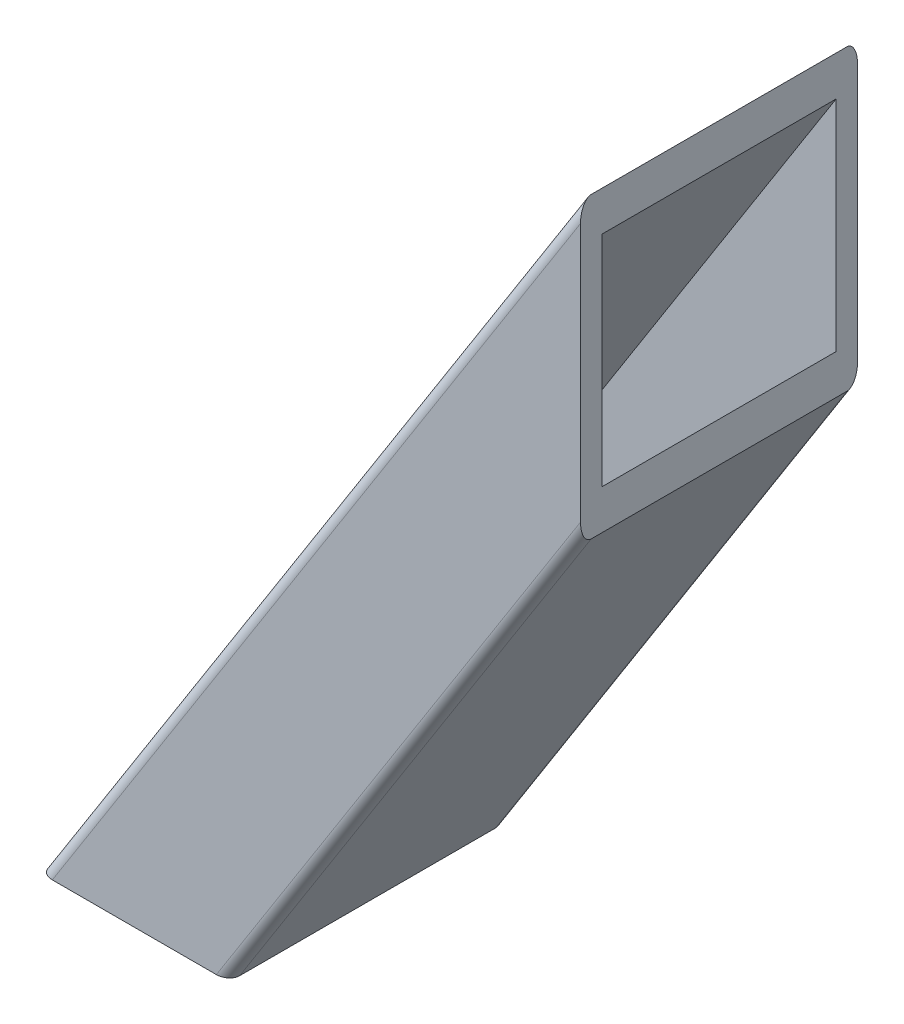
ISO-10303-21;
HEADER;
FILE_DESCRIPTION(('STEP AP214'),'2;1');
FILE_NAME('part.step','',(''),(''),'','','');
FILE_SCHEMA(('AUTOMOTIVE_DESIGN { 1 0 10303 214 1 1 1 1 }'));
ENDSEC;
DATA;
#1=APPLICATION_CONTEXT('core data for automotive mechanical design processes');
#2=APPLICATION_PROTOCOL_DEFINITION('international standard','automotive_design',2000,#1);
#3=PRODUCT_CONTEXT('',#1,'mechanical');
#4=PRODUCT('Part','Part','',(#3));
#5=PRODUCT_RELATED_PRODUCT_CATEGORY('part','',(#4));
#6=PRODUCT_DEFINITION_FORMATION('','',#4);
#7=PRODUCT_DEFINITION_CONTEXT('part definition',#1,'design');
#8=PRODUCT_DEFINITION('design','',#6,#7);
#9=PRODUCT_DEFINITION_SHAPE('','',#8);
#10=(LENGTH_UNIT() NAMED_UNIT(*) SI_UNIT(.MILLI.,.METRE.));
#11=(NAMED_UNIT(*) PLANE_ANGLE_UNIT() SI_UNIT($,.RADIAN.));
#12=(NAMED_UNIT(*) SI_UNIT($,.STERADIAN.) SOLID_ANGLE_UNIT());
#13=UNCERTAINTY_MEASURE_WITH_UNIT(LENGTH_MEASURE(1.E-05),#10,'distance_accuracy_value','');
#14=(GEOMETRIC_REPRESENTATION_CONTEXT(3) GLOBAL_UNCERTAINTY_ASSIGNED_CONTEXT((#13)) GLOBAL_UNIT_ASSIGNED_CONTEXT((#10,
#11,#12)) REPRESENTATION_CONTEXT('',''));
#15=CARTESIAN_POINT('',(0.,0.,0.));
#16=DIRECTION('',(0.,0.,1.));
#17=DIRECTION('',(1.,0.,0.));
#18=AXIS2_PLACEMENT_3D('',#15,#16,#17);
#19=CARTESIAN_POINT('',(32.9904848861495,80.,26.));
#20=DIRECTION('',(-1.,0.,0.));
#21=DIRECTION('',(0.,0.,1.));
#22=AXIS2_PLACEMENT_3D('',#19,#20,#21);
#23=PLANE('',#22);
#24=DIRECTION('',(0.,0.,-1.));
#25=VECTOR('',#24,1.);
#26=CARTESIAN_POINT('',(32.9904848861495,52.,26.));
#27=LINE('',#26,#25);
#28=CARTESIAN_POINT('',(32.9904848861495,52.,25.));
#29=VERTEX_POINT('',#28);
#30=CARTESIAN_POINT('',(32.9904848861495,52.,1.00000000000001));
#31=VERTEX_POINT('',#30);
#32=EDGE_CURVE('E217',#29,#31,#27,.T.);
#33=ORIENTED_EDGE('',*,*,#32,.T.);
#34=CARTESIAN_POINT('',(32.9904848861495,53.8666666666667,1.));
#35=DIRECTION('',(-1.,0.,0.));
#36=DIRECTION('',(0.,1.,0.));
#37=AXIS2_PLACEMENT_3D('',#34,#35,#36);
#38=ELLIPSE('',#37,1.86666666666667,1.);
#39=CARTESIAN_POINT('',(32.9904848861495,53.8666666666667,0.));
#40=VERTEX_POINT('',#39);
#41=EDGE_CURVE('E231',#31,#40,#38,.F.);
#42=ORIENTED_EDGE('',*,*,#41,.T.);
#43=DIRECTION('',(0.,1.,0.));
#44=VECTOR('',#43,1.);
#45=CARTESIAN_POINT('',(32.9904848861495,80.,0.));
#46=LINE('',#45,#44);
#47=CARTESIAN_POINT('',(32.9904848861495,78.1333333333333,0.));
#48=VERTEX_POINT('',#47);
#49=EDGE_CURVE('E192',#40,#48,#46,.T.);
#50=ORIENTED_EDGE('',*,*,#49,.T.);
#51=CARTESIAN_POINT('',(32.9904848861495,78.1333333333333,1.));
#52=DIRECTION('',(-1.,0.,0.));
#53=DIRECTION('',(0.,-1.,0.));
#54=AXIS2_PLACEMENT_3D('',#51,#52,#53);
#55=ELLIPSE('',#54,1.86666666666667,1.);
#56=CARTESIAN_POINT('',(32.9904848861495,80.,1.00000000000001));
#57=VERTEX_POINT('',#56);
#58=EDGE_CURVE('E229',#48,#57,#55,.F.);
#59=ORIENTED_EDGE('',*,*,#58,.T.);
#60=DIRECTION('',(0.,0.,-1.));
#61=VECTOR('',#60,1.);
#62=CARTESIAN_POINT('',(32.9904848861495,80.,26.));
#63=LINE('',#62,#61);
#64=CARTESIAN_POINT('',(32.9904848861495,80.,25.));
#65=VERTEX_POINT('',#64);
#66=EDGE_CURVE('E214',#65,#57,#63,.T.);
#67=ORIENTED_EDGE('',*,*,#66,.F.);
#68=CARTESIAN_POINT('',(32.9904848861495,78.1333333333333,25.));
#69=DIRECTION('',(-1.,0.,0.));
#70=DIRECTION('',(0.,1.,0.));
#71=AXIS2_PLACEMENT_3D('',#68,#69,#70);
#72=ELLIPSE('',#71,1.86666666666667,1.);
#73=CARTESIAN_POINT('',(32.9904848861495,78.1333333333333,26.));
#74=VERTEX_POINT('',#73);
#75=EDGE_CURVE('E225',#65,#74,#72,.F.);
#76=ORIENTED_EDGE('',*,*,#75,.T.);
#77=DIRECTION('',(0.,1.,0.));
#78=VECTOR('',#77,1.);
#79=CARTESIAN_POINT('',(32.9904848861495,80.,26.));
#80=LINE('',#79,#78);
#81=CARTESIAN_POINT('',(32.9904848861495,53.8666666666667,26.));
#82=VERTEX_POINT('',#81);
#83=EDGE_CURVE('E198',#82,#74,#80,.T.);
#84=ORIENTED_EDGE('',*,*,#83,.F.);
#85=CARTESIAN_POINT('',(32.9904848861495,53.8666666666667,25.));
#86=DIRECTION('',(-1.,0.,0.));
#87=DIRECTION('',(0.,-1.,0.));
#88=AXIS2_PLACEMENT_3D('',#85,#86,#87);
#89=ELLIPSE('',#88,1.86666666666667,1.);
#90=EDGE_CURVE('E227',#82,#29,#89,.F.);
#91=ORIENTED_EDGE('',*,*,#90,.T.);
#92=EDGE_LOOP('',(#33,#42,#50,#59,#67,#76,#84,#91));
#93=FACE_BOUND('',#92,.T.);
#94=DIRECTION('',(0.,1.,0.));
#95=VECTOR('',#94,1.);
#96=CARTESIAN_POINT('',(32.9904848861495,80.,2.));
#97=LINE('',#96,#95);
#98=CARTESIAN_POINT('',(32.9904848861495,55.7333333333333,2.));
#99=VERTEX_POINT('',#98);
#100=CARTESIAN_POINT('',(32.9904848861495,76.2666666666667,2.));
#101=VERTEX_POINT('',#100);
#102=EDGE_CURVE('E176',#99,#101,#97,.T.);
#103=ORIENTED_EDGE('',*,*,#102,.F.);
#104=DIRECTION('',(0.,0.,-1.));
#105=VECTOR('',#104,1.);
#106=CARTESIAN_POINT('',(32.9904848861495,55.7333333333333,26.));
#107=LINE('',#106,#105);
#108=CARTESIAN_POINT('',(32.9904848861495,55.7333333333333,24.));
#109=VERTEX_POINT('',#108);
#110=EDGE_CURVE('E190',#109,#99,#107,.T.);
#111=ORIENTED_EDGE('',*,*,#110,.F.);
#112=DIRECTION('',(0.,1.,0.));
#113=VECTOR('',#112,1.);
#114=CARTESIAN_POINT('',(32.9904848861495,80.,24.));
#115=LINE('',#114,#113);
#116=CARTESIAN_POINT('',(32.9904848861495,76.2666666666667,24.));
#117=VERTEX_POINT('',#116);
#118=EDGE_CURVE('E179',#109,#117,#115,.T.);
#119=ORIENTED_EDGE('',*,*,#118,.T.);
#120=DIRECTION('',(0.,0.,-1.));
#121=VECTOR('',#120,1.);
#122=CARTESIAN_POINT('',(32.9904848861495,76.2666666666667,26.));
#123=LINE('',#122,#121);
#124=EDGE_CURVE('E186',#117,#101,#123,.T.);
#125=ORIENTED_EDGE('',*,*,#124,.T.);
#126=EDGE_LOOP('',(#103,#111,#119,#125));
#127=FACE_BOUND('',#126,.T.);
#128=ADVANCED_FACE('F37',(#93,#127),#23,.F.);
#129=CARTESIAN_POINT('',(0.,0.,26.));
#130=DIRECTION('',(-0.844399315538349,0.535714285714286,0.));
#131=DIRECTION('',(-0.535714285714286,-0.844399315538349,0.));
#132=AXIS2_PLACEMENT_3D('',#129,#130,#131);
#133=PLANE('',#132);
#134=DIRECTION('',(0.,0.,-1.));
#135=VECTOR('',#134,1.);
#136=CARTESIAN_POINT('',(0.,0.,26.));
#137=LINE('',#136,#135);
#138=CARTESIAN_POINT('',(0.,0.,25.));
#139=VERTEX_POINT('',#138);
#140=CARTESIAN_POINT('',(0.,0.,1.00000000000001));
#141=VERTEX_POINT('',#140);
#142=EDGE_CURVE('E205',#139,#141,#137,.T.);
#143=ORIENTED_EDGE('',*,*,#142,.T.);
#144=DIRECTION('',(0.535714285714286,0.844399315538349,0.));
#145=VECTOR('',#144,1.);
#146=CARTESIAN_POINT('',(0.,0.,1.));
#147=LINE('',#146,#145);
#148=EDGE_CURVE('E222',#141,#31,#147,.T.);
#149=ORIENTED_EDGE('',*,*,#148,.T.);
#150=ORIENTED_EDGE('',*,*,#32,.F.);
#151=DIRECTION('',(0.535714285714286,0.844399315538349,0.));
#152=VECTOR('',#151,1.);
#153=CARTESIAN_POINT('',(0.,0.,25.));
#154=LINE('',#153,#152);
#155=EDGE_CURVE('E220',#29,#139,#154,.F.);
#156=ORIENTED_EDGE('',*,*,#155,.T.);
#157=EDGE_LOOP('',(#143,#149,#150,#156));
#158=FACE_BOUND('',#157,.T.);
#159=ADVANCED_FACE('F278',(#158),#133,.F.);
#160=CARTESIAN_POINT('',(-17.7641072463882,0.,26.));
#161=DIRECTION('',(0.844399315538349,-0.535714285714286,0.));
#162=DIRECTION('',(0.535714285714286,0.844399315538349,0.));
#163=AXIS2_PLACEMENT_3D('',#160,#161,#162);
#164=PLANE('',#163);
#165=ORIENTED_EDGE('',*,*,#66,.T.);
#166=DIRECTION('',(-0.535714285714286,-0.844399315538349,0.));
#167=VECTOR('',#166,1.);
#168=CARTESIAN_POINT('',(-17.7641072463882,0.,1.));
#169=LINE('',#168,#167);
#170=CARTESIAN_POINT('',(-17.7641072463882,0.,1.00000000000001));
#171=VERTEX_POINT('',#170);
#172=EDGE_CURVE('E245',#57,#171,#169,.T.);
#173=ORIENTED_EDGE('',*,*,#172,.T.);
#174=DIRECTION('',(0.,0.,-1.));
#175=VECTOR('',#174,1.);
#176=CARTESIAN_POINT('',(-17.7641072463882,0.,26.));
#177=LINE('',#176,#175);
#178=CARTESIAN_POINT('',(-17.7641072463882,0.,25.));
#179=VERTEX_POINT('',#178);
#180=EDGE_CURVE('E212',#179,#171,#177,.T.);
#181=ORIENTED_EDGE('',*,*,#180,.F.);
#182=DIRECTION('',(-0.535714285714286,-0.844399315538349,0.));
#183=VECTOR('',#182,1.);
#184=CARTESIAN_POINT('',(32.9904848861495,80.,25.));
#185=LINE('',#184,#183);
#186=EDGE_CURVE('E243',#179,#65,#185,.F.);
#187=ORIENTED_EDGE('',*,*,#186,.T.);
#188=EDGE_LOOP('',(#165,#173,#181,#187));
#189=FACE_BOUND('',#188,.T.);
#190=ADVANCED_FACE('F265',(#189),#164,.F.);
#191=CARTESIAN_POINT('',(0.,0.,26.));
#192=DIRECTION('',(0.,1.,0.));
#193=DIRECTION('',(-1.,0.,0.));
#194=AXIS2_PLACEMENT_3D('',#191,#192,#193);
#195=PLANE('',#194);
#196=DIRECTION('',(0.,0.,1.));
#197=VECTOR('',#196,1.);
#198=CARTESIAN_POINT('',(-1.09968282953832,0.,2.));
#199=LINE('',#198,#197);
#200=CARTESIAN_POINT('',(-1.09968282953832,0.,2.));
#201=VERTEX_POINT('',#200);
#202=CARTESIAN_POINT('',(-1.09968282953832,0.,24.));
#203=VERTEX_POINT('',#202);
#204=EDGE_CURVE('E165',#201,#203,#199,.T.);
#205=ORIENTED_EDGE('',*,*,#204,.F.);
#206=DIRECTION('',(1.,0.,0.));
#207=VECTOR('',#206,1.);
#208=CARTESIAN_POINT('',(-14.126694810223,0.,2.));
#209=LINE('',#208,#207);
#210=CARTESIAN_POINT('',(-14.126694810223,0.,2.));
#211=VERTEX_POINT('',#210);
#212=EDGE_CURVE('E145',#211,#201,#209,.T.);
#213=ORIENTED_EDGE('',*,*,#212,.F.);
#214=DIRECTION('',(0.,0.,-1.));
#215=VECTOR('',#214,1.);
#216=CARTESIAN_POINT('',(-14.126694810223,0.,24.));
#217=LINE('',#216,#215);
#218=CARTESIAN_POINT('',(-14.126694810223,0.,24.));
#219=VERTEX_POINT('',#218);
#220=EDGE_CURVE('E156',#219,#211,#217,.T.);
#221=ORIENTED_EDGE('',*,*,#220,.F.);
#222=DIRECTION('',(-1.,0.,0.));
#223=VECTOR('',#222,1.);
#224=CARTESIAN_POINT('',(-1.09968282953832,0.,24.));
#225=LINE('',#224,#223);
#226=EDGE_CURVE('E167',#203,#219,#225,.T.);
#227=ORIENTED_EDGE('',*,*,#226,.F.);
#228=EDGE_LOOP('',(#205,#213,#221,#227));
#229=FACE_BOUND('',#228,.T.);
#230=DIRECTION('',(1.,0.,0.));
#231=VECTOR('',#230,1.);
#232=CARTESIAN_POINT('',(0.,0.,0.));
#233=LINE('',#232,#231);
#234=CARTESIAN_POINT('',(-16.5798334299623,0.,0.));
#235=VERTEX_POINT('',#234);
#236=CARTESIAN_POINT('',(-1.18427381642588,0.,0.));
#237=VERTEX_POINT('',#236);
#238=EDGE_CURVE('E202',#235,#237,#233,.T.);
#239=ORIENTED_EDGE('',*,*,#238,.T.);
#240=CARTESIAN_POINT('',(-1.18427381642588,0.,1.));
#241=DIRECTION('',(0.,1.,0.));
#242=DIRECTION('',(1.,0.,0.));
#243=AXIS2_PLACEMENT_3D('',#240,#241,#242);
#244=ELLIPSE('',#243,1.18427381642588,1.);
#245=EDGE_CURVE('E241',#237,#141,#244,.F.);
#246=ORIENTED_EDGE('',*,*,#245,.T.);
#247=ORIENTED_EDGE('',*,*,#142,.F.);
#248=CARTESIAN_POINT('',(-1.18427381642588,0.,25.));
#249=DIRECTION('',(0.,1.,0.));
#250=DIRECTION('',(-1.,0.,0.));
#251=AXIS2_PLACEMENT_3D('',#248,#249,#250);
#252=ELLIPSE('',#251,1.18427381642588,1.);
#253=CARTESIAN_POINT('',(-1.18427381642588,0.,26.));
#254=VERTEX_POINT('',#253);
#255=EDGE_CURVE('E238',#139,#254,#252,.F.);
#256=ORIENTED_EDGE('',*,*,#255,.T.);
#257=DIRECTION('',(1.,0.,0.));
#258=VECTOR('',#257,1.);
#259=CARTESIAN_POINT('',(0.,0.,26.));
#260=LINE('',#259,#258);
#261=CARTESIAN_POINT('',(-16.5798334299623,0.,26.));
#262=VERTEX_POINT('',#261);
#263=EDGE_CURVE('E201',#262,#254,#260,.T.);
#264=ORIENTED_EDGE('',*,*,#263,.F.);
#265=CARTESIAN_POINT('',(-16.5798334299623,0.,25.));
#266=DIRECTION('',(0.,1.,0.));
#267=DIRECTION('',(1.,0.,0.));
#268=AXIS2_PLACEMENT_3D('',#265,#266,#267);
#269=ELLIPSE('',#268,1.18427381642588,1.);
#270=EDGE_CURVE('E60',#262,#179,#269,.F.);
#271=ORIENTED_EDGE('',*,*,#270,.T.);
#272=ORIENTED_EDGE('',*,*,#180,.T.);
#273=CARTESIAN_POINT('',(-16.5798334299623,0.,1.));
#274=DIRECTION('',(0.,1.,0.));
#275=DIRECTION('',(-1.,0.,0.));
#276=AXIS2_PLACEMENT_3D('',#273,#274,#275);
#277=ELLIPSE('',#276,1.18427381642588,1.);
#278=EDGE_CURVE('E52',#171,#235,#277,.F.);
#279=ORIENTED_EDGE('',*,*,#278,.T.);
#280=EDGE_LOOP('',(#239,#246,#247,#256,#264,#271,#272,#279));
#281=FACE_BOUND('',#280,.T.);
#282=ADVANCED_FACE('F163',(#229,#281),#195,.F.);
#283=CARTESIAN_POINT('',(0.,0.,26.));
#284=DIRECTION('',(0.,0.,1.));
#285=DIRECTION('',(1.,0.,0.));
#286=AXIS2_PLACEMENT_3D('',#283,#284,#285);
#287=PLANE('',#286);
#288=ORIENTED_EDGE('',*,*,#263,.T.);
#289=DIRECTION('',(0.535714285714286,0.844399315538349,0.));
#290=VECTOR('',#289,1.);
#291=CARTESIAN_POINT('',(32.1460855706111,52.5357142857143,26.));
#292=LINE('',#291,#290);
#293=EDGE_CURVE('E11',#254,#82,#292,.T.);
#294=ORIENTED_EDGE('',*,*,#293,.T.);
#295=ORIENTED_EDGE('',*,*,#83,.T.);
#296=DIRECTION('',(-0.535714285714286,-0.844399315538349,0.));
#297=VECTOR('',#296,1.);
#298=CARTESIAN_POINT('',(-16.9197079308498,-0.535714285714285,26.));
#299=LINE('',#298,#297);
#300=EDGE_CURVE('E45',#74,#262,#299,.T.);
#301=ORIENTED_EDGE('',*,*,#300,.T.);
#302=EDGE_LOOP('',(#288,#294,#295,#301));
#303=FACE_BOUND('',#302,.T.);
#304=ADVANCED_FACE('F249',(#303),#287,.T.);
#305=CARTESIAN_POINT('',(0.,0.,0.));
#306=DIRECTION('',(0.,0.,1.));
#307=DIRECTION('',(1.,0.,0.));
#308=AXIS2_PLACEMENT_3D('',#305,#306,#307);
#309=PLANE('',#308);
#310=ORIENTED_EDGE('',*,*,#49,.F.);
#311=DIRECTION('',(0.535714285714286,0.844399315538349,0.));
#312=VECTOR('',#311,1.);
#313=CARTESIAN_POINT('',(-0.844399315538349,0.535714285714286,0.));
#314=LINE('',#313,#312);
#315=EDGE_CURVE('E235',#40,#237,#314,.F.);
#316=ORIENTED_EDGE('',*,*,#315,.T.);
#317=ORIENTED_EDGE('',*,*,#238,.F.);
#318=DIRECTION('',(-0.535714285714286,-0.844399315538349,0.));
#319=VECTOR('',#318,1.);
#320=CARTESIAN_POINT('',(-11.8215904175369,7.5,0.));
#321=LINE('',#320,#319);
#322=EDGE_CURVE('E233',#235,#48,#321,.F.);
#323=ORIENTED_EDGE('',*,*,#322,.T.);
#324=EDGE_LOOP('',(#310,#316,#317,#323));
#325=FACE_BOUND('',#324,.T.);
#326=ADVANCED_FACE('F270',(#325),#309,.F.);
#327=CARTESIAN_POINT('',(-1.6887986310767,1.07142857142857,26.));
#328=DIRECTION('',(-0.844399315538349,0.535714285714286,0.));
#329=DIRECTION('',(-0.535714285714286,-0.844399315538349,0.));
#330=AXIS2_PLACEMENT_3D('',#327,#328,#329);
#331=PLANE('',#330);
#332=DIRECTION('',(0.535714285714286,0.844399315538349,0.));
#333=VECTOR('',#332,1.);
#334=CARTESIAN_POINT('',(-1.6887986310767,1.07142857142857,2.));
#335=LINE('',#334,#333);
#336=CARTESIAN_POINT('',(-1.09968282953832,2.,2.));
#337=VERTEX_POINT('',#336);
#338=EDGE_CURVE('E160',#337,#99,#335,.T.);
#339=ORIENTED_EDGE('',*,*,#338,.F.);
#340=DIRECTION('',(0.,0.,-1.));
#341=VECTOR('',#340,1.);
#342=CARTESIAN_POINT('',(-1.09968282953832,2.,26.));
#343=LINE('',#342,#341);
#344=CARTESIAN_POINT('',(-1.09968282953832,2.,24.));
#345=VERTEX_POINT('',#344);
#346=EDGE_CURVE('E180',#345,#337,#343,.T.);
#347=ORIENTED_EDGE('',*,*,#346,.F.);
#348=DIRECTION('',(0.535714285714286,0.844399315538349,0.));
#349=VECTOR('',#348,1.);
#350=CARTESIAN_POINT('',(-1.6887986310767,1.07142857142857,24.));
#351=LINE('',#350,#349);
#352=EDGE_CURVE('E177',#345,#109,#351,.T.);
#353=ORIENTED_EDGE('',*,*,#352,.T.);
#354=ORIENTED_EDGE('',*,*,#110,.T.);
#355=EDGE_LOOP('',(#339,#347,#353,#354));
#356=FACE_BOUND('',#355,.T.);
#357=ADVANCED_FACE('F324',(#356),#331,.T.);
#358=CARTESIAN_POINT('',(-16.0753086153115,-1.07142857142857,26.));
#359=DIRECTION('',(0.844399315538349,-0.535714285714286,0.));
#360=DIRECTION('',(0.535714285714286,0.844399315538349,0.));
#361=AXIS2_PLACEMENT_3D('',#358,#359,#360);
#362=PLANE('',#361);
#363=DIRECTION('',(-0.535714285714286,-0.844399315538349,0.));
#364=VECTOR('',#363,1.);
#365=CARTESIAN_POINT('',(-16.0753086153115,-1.07142857142857,2.));
#366=LINE('',#365,#364);
#367=CARTESIAN_POINT('',(-14.126694810223,2.,2.));
#368=VERTEX_POINT('',#367);
#369=EDGE_CURVE('E148',#101,#368,#366,.T.);
#370=ORIENTED_EDGE('',*,*,#369,.F.);
#371=ORIENTED_EDGE('',*,*,#124,.F.);
#372=DIRECTION('',(-0.535714285714286,-0.844399315538349,0.));
#373=VECTOR('',#372,1.);
#374=CARTESIAN_POINT('',(-16.0753086153115,-1.07142857142857,24.));
#375=LINE('',#374,#373);
#376=CARTESIAN_POINT('',(-14.126694810223,2.,24.));
#377=VERTEX_POINT('',#376);
#378=EDGE_CURVE('E184',#117,#377,#375,.T.);
#379=ORIENTED_EDGE('',*,*,#378,.T.);
#380=DIRECTION('',(0.,0.,-1.));
#381=VECTOR('',#380,1.);
#382=CARTESIAN_POINT('',(-14.126694810223,2.,26.));
#383=LINE('',#382,#381);
#384=EDGE_CURVE('E183',#377,#368,#383,.T.);
#385=ORIENTED_EDGE('',*,*,#384,.T.);
#386=EDGE_LOOP('',(#370,#371,#379,#385));
#387=FACE_BOUND('',#386,.T.);
#388=ADVANCED_FACE('F393',(#387),#362,.T.);
#389=CARTESIAN_POINT('',(0.,0.,24.));
#390=DIRECTION('',(0.,0.,1.));
#391=DIRECTION('',(1.,0.,0.));
#392=AXIS2_PLACEMENT_3D('',#389,#390,#391);
#393=PLANE('',#392);
#394=ORIENTED_EDGE('',*,*,#352,.F.);
#395=DIRECTION('',(0.,1.,0.));
#396=VECTOR('',#395,1.);
#397=CARTESIAN_POINT('',(-1.09968282953832,-0.00100000000000013,24.));
#398=LINE('',#397,#396);
#399=EDGE_CURVE('E172',#203,#345,#398,.T.);
#400=ORIENTED_EDGE('',*,*,#399,.F.);
#401=ORIENTED_EDGE('',*,*,#226,.T.);
#402=DIRECTION('',(0.,1.,0.));
#403=VECTOR('',#402,1.);
#404=CARTESIAN_POINT('',(-14.126694810223,-0.00100000000000013,24.));
#405=LINE('',#404,#403);
#406=EDGE_CURVE('E152',#219,#377,#405,.T.);
#407=ORIENTED_EDGE('',*,*,#406,.T.);
#408=ORIENTED_EDGE('',*,*,#378,.F.);
#409=ORIENTED_EDGE('',*,*,#118,.F.);
#410=EDGE_LOOP('',(#394,#400,#401,#407,#408,#409));
#411=FACE_BOUND('',#410,.T.);
#412=ADVANCED_FACE('F383',(#411),#393,.F.);
#413=CARTESIAN_POINT('',(0.,0.,2.));
#414=DIRECTION('',(0.,0.,1.));
#415=DIRECTION('',(1.,0.,0.));
#416=AXIS2_PLACEMENT_3D('',#413,#414,#415);
#417=PLANE('',#416);
#418=ORIENTED_EDGE('',*,*,#338,.T.);
#419=ORIENTED_EDGE('',*,*,#102,.T.);
#420=ORIENTED_EDGE('',*,*,#369,.T.);
#421=DIRECTION('',(0.,1.,0.));
#422=VECTOR('',#421,1.);
#423=CARTESIAN_POINT('',(-14.126694810223,-0.00100000000000013,2.));
#424=LINE('',#423,#422);
#425=EDGE_CURVE('E140',#211,#368,#424,.T.);
#426=ORIENTED_EDGE('',*,*,#425,.F.);
#427=ORIENTED_EDGE('',*,*,#212,.T.);
#428=DIRECTION('',(0.,1.,0.));
#429=VECTOR('',#428,1.);
#430=CARTESIAN_POINT('',(-1.09968282953832,-0.00100000000000013,2.));
#431=LINE('',#430,#429);
#432=EDGE_CURVE('E161',#201,#337,#431,.T.);
#433=ORIENTED_EDGE('',*,*,#432,.T.);
#434=EDGE_LOOP('',(#418,#419,#420,#426,#427,#433));
#435=FACE_BOUND('',#434,.T.);
#436=ADVANCED_FACE('F143',(#435),#417,.T.);
#437=CARTESIAN_POINT('',(-1.09968282953832,-0.00100000000000013,2.));
#438=DIRECTION('',(1.,0.,0.));
#439=DIRECTION('',(0.,1.,0.));
#440=AXIS2_PLACEMENT_3D('',#437,#438,#439);
#441=PLANE('',#440);
#442=ORIENTED_EDGE('',*,*,#204,.T.);
#443=ORIENTED_EDGE('',*,*,#399,.T.);
#444=ORIENTED_EDGE('',*,*,#346,.T.);
#445=ORIENTED_EDGE('',*,*,#432,.F.);
#446=EDGE_LOOP('',(#442,#443,#444,#445));
#447=FACE_BOUND('',#446,.T.);
#448=ADVANCED_FACE('F365',(#447),#441,.F.);
#449=CARTESIAN_POINT('',(-14.126694810223,-0.00100000000000013,24.));
#450=DIRECTION('',(-1.,0.,0.));
#451=DIRECTION('',(0.,-1.,0.));
#452=AXIS2_PLACEMENT_3D('',#449,#450,#451);
#453=PLANE('',#452);
#454=ORIENTED_EDGE('',*,*,#220,.T.);
#455=ORIENTED_EDGE('',*,*,#425,.T.);
#456=ORIENTED_EDGE('',*,*,#384,.F.);
#457=ORIENTED_EDGE('',*,*,#406,.F.);
#458=EDGE_LOOP('',(#454,#455,#456,#457));
#459=FACE_BOUND('',#458,.T.);
#460=ADVANCED_FACE('F157',(#459),#453,.F.);
#461=CARTESIAN_POINT('',(-0.844399315538349,0.535714285714286,1.));
#462=DIRECTION('',(0.535714285714286,0.844399315538349,0.));
#463=DIRECTION('',(-0.844399315538349,0.535714285714286,0.));
#464=AXIS2_PLACEMENT_3D('',#461,#462,#463);
#465=CYLINDRICAL_SURFACE('',#464,1.);
#466=ORIENTED_EDGE('',*,*,#245,.F.);
#467=ORIENTED_EDGE('',*,*,#315,.F.);
#468=ORIENTED_EDGE('',*,*,#41,.F.);
#469=ORIENTED_EDGE('',*,*,#148,.F.);
#470=EDGE_LOOP('',(#466,#467,#468,#469));
#471=FACE_BOUND('',#470,.T.);
#472=ADVANCED_FACE('F275',(#471),#465,.T.);
#473=CARTESIAN_POINT('',(-16.9197079308498,-0.535714285714286,1.));
#474=DIRECTION('',(-0.535714285714286,-0.844399315538349,0.));
#475=DIRECTION('',(0.844399315538349,-0.535714285714286,0.));
#476=AXIS2_PLACEMENT_3D('',#473,#474,#475);
#477=CYLINDRICAL_SURFACE('',#476,1.);
#478=ORIENTED_EDGE('',*,*,#58,.F.);
#479=ORIENTED_EDGE('',*,*,#322,.F.);
#480=ORIENTED_EDGE('',*,*,#278,.F.);
#481=ORIENTED_EDGE('',*,*,#172,.F.);
#482=EDGE_LOOP('',(#478,#479,#480,#481));
#483=FACE_BOUND('',#482,.T.);
#484=ADVANCED_FACE('F273',(#483),#477,.T.);
#485=CARTESIAN_POINT('',(-0.844399315538349,0.535714285714286,25.));
#486=DIRECTION('',(-0.535714285714286,-0.844399315538349,0.));
#487=DIRECTION('',(0.844399315538349,-0.535714285714286,0.));
#488=AXIS2_PLACEMENT_3D('',#485,#486,#487);
#489=CYLINDRICAL_SURFACE('',#488,1.);
#490=ORIENTED_EDGE('',*,*,#255,.F.);
#491=ORIENTED_EDGE('',*,*,#155,.F.);
#492=ORIENTED_EDGE('',*,*,#90,.F.);
#493=ORIENTED_EDGE('',*,*,#293,.F.);
#494=EDGE_LOOP('',(#490,#491,#492,#493));
#495=FACE_BOUND('',#494,.T.);
#496=ADVANCED_FACE('F258',(#495),#489,.T.);
#497=CARTESIAN_POINT('',(-11.8215904175369,7.5,25.));
#498=DIRECTION('',(0.535714285714286,0.844399315538349,0.));
#499=DIRECTION('',(-0.844399315538349,0.535714285714286,0.));
#500=AXIS2_PLACEMENT_3D('',#497,#498,#499);
#501=CYLINDRICAL_SURFACE('',#500,1.);
#502=ORIENTED_EDGE('',*,*,#75,.F.);
#503=ORIENTED_EDGE('',*,*,#186,.F.);
#504=ORIENTED_EDGE('',*,*,#270,.F.);
#505=ORIENTED_EDGE('',*,*,#300,.F.);
#506=EDGE_LOOP('',(#502,#503,#504,#505));
#507=FACE_BOUND('',#506,.T.);
#508=ADVANCED_FACE('F39',(#507),#501,.T.);
#509=CLOSED_SHELL('',(#128,#159,#190,#282,#304,#326,#357,#388,#412,#436,#448,#460,#472,#484,
#496,#508));
#510=MANIFOLD_SOLID_BREP('B2',#509);
#511=ADVANCED_BREP_SHAPE_REPRESENTATION('',(#18,#510),#14);
#512=SHAPE_DEFINITION_REPRESENTATION(#9,#511);
ENDSEC;
END-ISO-10303-21;
